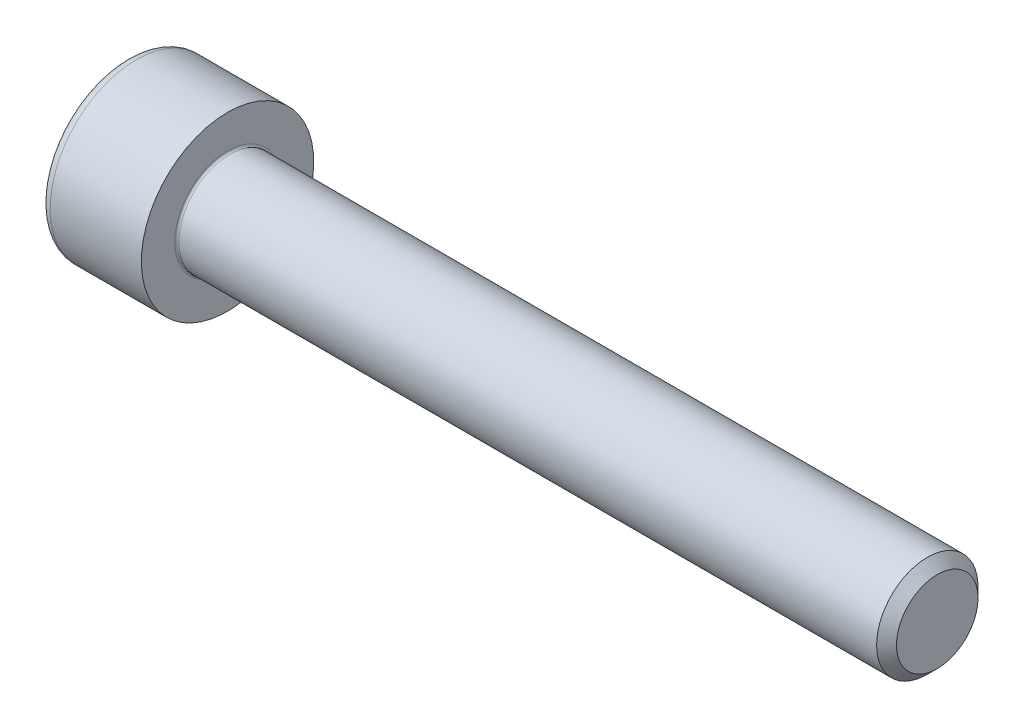
ISO-10303-21;
HEADER;
FILE_DESCRIPTION(('STEP AP214'),'2;1');
FILE_NAME('part.step','',(''),(''),'','','');
FILE_SCHEMA(('AUTOMOTIVE_DESIGN { 1 0 10303 214 1 1 1 1 }'));
ENDSEC;
DATA;
#1=APPLICATION_CONTEXT('core data for automotive mechanical design processes');
#2=APPLICATION_PROTOCOL_DEFINITION('international standard','automotive_design',2000,#1);
#3=PRODUCT_CONTEXT('',#1,'mechanical');
#4=PRODUCT('Part','Part','',(#3));
#5=PRODUCT_RELATED_PRODUCT_CATEGORY('part','',(#4));
#6=PRODUCT_DEFINITION_FORMATION('','',#4);
#7=PRODUCT_DEFINITION_CONTEXT('part definition',#1,'design');
#8=PRODUCT_DEFINITION('design','',#6,#7);
#9=PRODUCT_DEFINITION_SHAPE('','',#8);
#10=(LENGTH_UNIT() NAMED_UNIT(*) SI_UNIT(.MILLI.,.METRE.));
#11=(NAMED_UNIT(*) PLANE_ANGLE_UNIT() SI_UNIT($,.RADIAN.));
#12=(NAMED_UNIT(*) SI_UNIT($,.STERADIAN.) SOLID_ANGLE_UNIT());
#13=UNCERTAINTY_MEASURE_WITH_UNIT(LENGTH_MEASURE(1.E-05),#10,'distance_accuracy_value','');
#14=(GEOMETRIC_REPRESENTATION_CONTEXT(3) GLOBAL_UNCERTAINTY_ASSIGNED_CONTEXT((#13)) GLOBAL_UNIT_ASSIGNED_CONTEXT((#10,
#11,#12)) REPRESENTATION_CONTEXT('',''));
#15=CARTESIAN_POINT('',(0.,0.,0.));
#16=DIRECTION('',(0.,0.,1.));
#17=DIRECTION('',(1.,0.,0.));
#18=AXIS2_PLACEMENT_3D('',#15,#16,#17);
#19=CARTESIAN_POINT('',(-2.50800000128493,0.,0.));
#20=DIRECTION('',(-1.,0.,0.));
#21=DIRECTION('',(0.,0.,1.));
#22=AXIS2_PLACEMENT_3D('',#19,#20,#21);
#23=CONICAL_SURFACE('',#22,2.32325748231688,1.04719754991398);
#24=CARTESIAN_POINT('',(-1.16666666468745,-1.70530256582424E-10,0.));
#25=VERTEX_POINT('',#24);
#26=VERTEX_LOOP('',#25);
#27=FACE_BOUND('',#26,.T.);
#28=CARTESIAN_POINT('',(-2.50000000144598,2.00000000032935,1.15470053796183));
#29=CARTESIAN_POINT('',(-2.47069554662332,2.00000000011829,1.05321634684252));
#30=CARTESIAN_POINT('',(-2.44404467857914,2.00000000003171,0.950856145644057));
#31=CARTESIAN_POINT('',(-2.39752638879754,1.99999999996822,0.74436344483934));
#32=CARTESIAN_POINT('',(-2.37767542167161,1.99999999999159,0.640227277451711));
#33=CARTESIAN_POINT('',(-2.34677596020227,2.00000000000821,0.433245449996193));
#34=CARTESIAN_POINT('',(-2.33552178883748,2.00000000000219,0.330431627814834));
#35=CARTESIAN_POINT('',(-2.32208916936555,1.99999999999782,0.124320462843912));
#36=CARTESIAN_POINT('',(-2.31989959521926,1.99999999999945,0.0210238686983639));
#37=CARTESIAN_POINT('',(-2.32446629144478,2.00000000000048,-0.17197473597635));
#38=CARTESIAN_POINT('',(-2.33010128653034,2.00000000000013,-0.261705707519009));
#39=CARTESIAN_POINT('',(-2.34795730208613,1.99999999999987,-0.440583082591421));
#40=CARTESIAN_POINT('',(-2.36018441616651,1.99999999999996,-0.52972886789387));
#41=CARTESIAN_POINT('',(-2.39074983480228,2.00000000000004,-0.708974747227483));
#42=CARTESIAN_POINT('',(-2.40921764371906,2.00000000000002,-0.799052166717739));
#43=CARTESIAN_POINT('',(-2.45113176241741,1.99999999999998,-0.977863889553509));
#44=CARTESIAN_POINT('',(-2.47456823037067,1.99999999999996,-1.06660048191678));
#45=CARTESIAN_POINT('',(-2.50000000166014,2.,-1.15470053795676));
#46=B_SPLINE_CURVE_WITH_KNOTS('',3,(#28,#29,#30,#31,#32,#33,#34,#35,#36,#37,#38,#39,#40,#41,#42,
#43,#44,#45),.UNSPECIFIED.,.F.,.F.,(4,2,2,2,2,2,2,2,4),(0.,0.317016011622895,0.6347938171706,
0.944707606337703,1.25424088911858,1.52370778260774,1.79342419352783,2.06912162199575,
2.3442779727913),.UNSPECIFIED.);
#47=CARTESIAN_POINT('',(-2.50000000164502,1.99999999979437,1.15470053826053));
#48=VERTEX_POINT('',#47);
#49=CARTESIAN_POINT('',(-2.50000000171356,2.,-1.15470053814181));
#50=VERTEX_POINT('',#49);
#51=EDGE_CURVE('E21',#48,#50,#46,.T.);
#52=ORIENTED_EDGE('',*,*,#51,.T.);
#53=CARTESIAN_POINT('',(-2.50000000144598,1.99999999980318,-1.15470053887319));
#54=CARTESIAN_POINT('',(-2.47069554662332,1.91211211210581,-1.20544263425006));
#55=CARTESIAN_POINT('',(-2.44404467857914,1.82346557748816,-1.2566227347743));
#56=CARTESIAN_POINT('',(-2.39752638879754,1.64463765286348,-1.35986908512169));
#57=CARTESIAN_POINT('',(-2.37767542167161,1.55445308646473,-1.41193716883574));
#58=CARTESIAN_POINT('',(-2.34677596020227,1.37520156577483,-1.51542808257789));
#59=CARTESIAN_POINT('',(-2.33552178883748,1.28616218390259,-1.56683499366335));
#60=CARTESIAN_POINT('',(-2.32208916936555,1.10766467903198,-1.66989057614503));
#61=CARTESIAN_POINT('',(-2.31989959521926,1.01820720437834,-1.72153887321922));
#62=CARTESIAN_POINT('',(-2.32446629144478,0.851065509835601,-1.81803817555747));
#63=CARTESIAN_POINT('',(-2.33010128653034,0.773356208973225,-1.86290366132849));
#64=CARTESIAN_POINT('',(-2.34795730208613,0.61844385799811,-1.95234234886448));
#65=CARTESIAN_POINT('',(-2.36018441616651,0.541241343285922,-1.99691524151578));
#66=CARTESIAN_POINT('',(-2.39074983480228,0.38600985825937,-2.08653818118265));
#67=CARTESIAN_POINT('',(-2.40921764371906,0.30800052467345,-2.13157689092776));
#68=CARTESIAN_POINT('',(-2.45113176241741,0.153145030203193,-2.22098275234562));
#69=CARTESIAN_POINT('',(-2.47456823037067,0.0762968869713288,-2.26535104852723));
#70=CARTESIAN_POINT('',(-2.50000000166014,3.65892201025004E-10,-2.30940107654726));
#71=B_SPLINE_CURVE_WITH_KNOTS('',3,(#53,#54,#55,#56,#57,#58,#59,#60,#61,#62,#63,#64,#65,#66,#67,
#68,#69,#70),.UNSPECIFIED.,.F.,.F.,(4,2,2,2,2,2,2,2,4),(0.,0.317016011622895,0.634793817170599,
0.944707606337703,1.25424088911857,1.52370778260774,1.79342419352783,2.06912162199575,
2.3442779727913),.UNSPECIFIED.);
#72=CARTESIAN_POINT('',(-2.50000000164502,0.,-2.30940107652106));
#73=VERTEX_POINT('',#72);
#74=EDGE_CURVE('E81',#50,#73,#71,.T.);
#75=ORIENTED_EDGE('',*,*,#74,.T.);
#76=CARTESIAN_POINT('',(-2.50000000144598,-5.26170709146343E-10,-2.30940107683502));
#77=CARTESIAN_POINT('',(-2.47069554662332,-0.0878878880124767,-2.25865898109258));
#78=CARTESIAN_POINT('',(-2.44404467857914,-0.17653442254354,-2.20747888041836));
#79=CARTESIAN_POINT('',(-2.39752638879754,-0.355362347104743,-2.10423252996103));
#80=CARTESIAN_POINT('',(-2.37767542167161,-0.445546913526861,-2.05216444628745));
#81=CARTESIAN_POINT('',(-2.34677596020227,-0.624798434233376,-1.94867353257408));
#82=CARTESIAN_POINT('',(-2.33552178883748,-0.7138378160996,-1.89726662147819));
#83=CARTESIAN_POINT('',(-2.32208916936555,-0.892335320965837,-1.79421103898894));
#84=CARTESIAN_POINT('',(-2.31989959521926,-0.981792795621112,-1.74256274191759));
#85=CARTESIAN_POINT('',(-2.32446629144478,-1.14893449016488,-1.64606343958112));
#86=CARTESIAN_POINT('',(-2.33010128653034,-1.2266437910269,-1.60119795380949));
#87=CARTESIAN_POINT('',(-2.34795730208613,-1.38155614200176,-1.51175926627306));
#88=CARTESIAN_POINT('',(-2.36018441616651,-1.45875865671404,-1.46718637362191));
#89=CARTESIAN_POINT('',(-2.39074983480228,-1.61399014174067,-1.37756343395517));
#90=CARTESIAN_POINT('',(-2.40921764371906,-1.69199947532657,-1.33252472421003));
#91=CARTESIAN_POINT('',(-2.45113176241741,-1.84685496979679,-1.24311886279211));
#92=CARTESIAN_POINT('',(-2.47456823037067,-1.92370311302863,-1.19875056661046));
#93=CARTESIAN_POINT('',(-2.50000000166014,-1.99999999963411,-1.1547005385905));
#94=B_SPLINE_CURVE_WITH_KNOTS('',3,(#76,#77,#78,#79,#80,#81,#82,#83,#84,#85,#86,#87,#88,#89,#90,
#91,#92,#93),.UNSPECIFIED.,.F.,.F.,(4,2,2,2,2,2,2,2,4),(0.,0.317016011622895,0.634793817170599,
0.944707606337702,1.25424088911857,1.52370778260774,1.79342419352783,2.06912162199575,
2.3442779727913),.UNSPECIFIED.);
#95=CARTESIAN_POINT('',(-2.50000000164502,-1.99999999979437,-1.15470053826053));
#96=VERTEX_POINT('',#95);
#97=EDGE_CURVE('E106',#73,#96,#94,.T.);
#98=ORIENTED_EDGE('',*,*,#97,.T.);
#99=CARTESIAN_POINT('',(-2.50000000144598,-2.00000000032935,-1.15470053796183));
#100=CARTESIAN_POINT('',(-2.47069554662332,-2.00000000011829,-1.05321634684252));
#101=CARTESIAN_POINT('',(-2.44404467857914,-2.0000000000317,-0.95085614564406));
#102=CARTESIAN_POINT('',(-2.39752638879754,-1.99999999996822,-0.744363444839343));
#103=CARTESIAN_POINT('',(-2.37767542167161,-1.99999999999159,-0.640227277451715));
#104=CARTESIAN_POINT('',(-2.34677596020227,-2.00000000000821,-0.433245449996196));
#105=CARTESIAN_POINT('',(-2.33552178883748,-2.00000000000219,-0.330431627814838));
#106=CARTESIAN_POINT('',(-2.32208916936555,-1.99999999999782,-0.124320462843916));
#107=CARTESIAN_POINT('',(-2.31989959521926,-1.99999999999945,-0.0210238686983675));
#108=CARTESIAN_POINT('',(-2.32446629144478,-2.00000000000048,0.171974735976346));
#109=CARTESIAN_POINT('',(-2.33010128653034,-2.00000000000013,0.261705707519006));
#110=CARTESIAN_POINT('',(-2.34795730208613,-1.99999999999987,0.440583082591418));
#111=CARTESIAN_POINT('',(-2.36018441616651,-1.99999999999996,0.529728867893867));
#112=CARTESIAN_POINT('',(-2.39074983480228,-2.00000000000004,0.70897474722748));
#113=CARTESIAN_POINT('',(-2.40921764371906,-2.00000000000002,0.799052166717737));
#114=CARTESIAN_POINT('',(-2.45113176241741,-1.99999999999998,0.977863889553506));
#115=CARTESIAN_POINT('',(-2.47456823037067,-1.99999999999996,1.06660048191678));
#116=CARTESIAN_POINT('',(-2.50000000166014,-2.,1.15470053795676));
#117=B_SPLINE_CURVE_WITH_KNOTS('',3,(#99,#100,#101,#102,#103,#104,#105,#106,#107,#108,#109,#110,
#111,#112,#113,#114,#115,#116),.UNSPECIFIED.,.F.,.F.,(4,2,2,2,2,2,2,2,4),(0.,0.317016011622895,
0.634793817170599,0.944707606337703,1.25424088911857,1.52370778260774,1.79342419352783,
2.06912162199575,2.3442779727913),.UNSPECIFIED.);
#118=CARTESIAN_POINT('',(-2.50000000164502,-1.99999999979437,1.15470053826053));
#119=VERTEX_POINT('',#118);
#120=EDGE_CURVE('E130',#96,#119,#117,.T.);
#121=ORIENTED_EDGE('',*,*,#120,.T.);
#122=CARTESIAN_POINT('',(-2.50000000144598,-1.99999999980318,1.15470053887318));
#123=CARTESIAN_POINT('',(-2.47069554662332,-1.91211211210581,1.20544263425006));
#124=CARTESIAN_POINT('',(-2.44404467857914,-1.82346557748816,1.2566227347743));
#125=CARTESIAN_POINT('',(-2.39752638879754,-1.64463765286348,1.35986908512168));
#126=CARTESIAN_POINT('',(-2.37767542167161,-1.55445308646473,1.41193716883573));
#127=CARTESIAN_POINT('',(-2.34677596020227,-1.37520156577483,1.51542808257788));
#128=CARTESIAN_POINT('',(-2.33552178883748,-1.28616218390259,1.56683499366335));
#129=CARTESIAN_POINT('',(-2.32208916936555,-1.10766467903198,1.66989057614503));
#130=CARTESIAN_POINT('',(-2.31989959521926,-1.01820720437834,1.72153887321922));
#131=CARTESIAN_POINT('',(-2.32446629144478,-0.851065509835602,1.81803817555746));
#132=CARTESIAN_POINT('',(-2.33010128653034,-0.773356208973226,1.86290366132849));
#133=CARTESIAN_POINT('',(-2.34795730208613,-0.61844385799811,1.95234234886448));
#134=CARTESIAN_POINT('',(-2.36018441616651,-0.541241343285922,1.99691524151578));
#135=CARTESIAN_POINT('',(-2.39074983480228,-0.38600985825937,2.08653818118265));
#136=CARTESIAN_POINT('',(-2.40921764371906,-0.30800052467345,2.13157689092776));
#137=CARTESIAN_POINT('',(-2.45113176241741,-0.153145030203193,2.22098275234561));
#138=CARTESIAN_POINT('',(-2.47456823037067,-0.076296886971328,2.26535104852723));
#139=CARTESIAN_POINT('',(-2.50000000166014,-3.65891067023528E-10,2.30940107654726));
#140=B_SPLINE_CURVE_WITH_KNOTS('',3,(#122,#123,#124,#125,#126,#127,#128,#129,#130,#131,#132,
#133,#134,#135,#136,#137,#138,#139),.UNSPECIFIED.,.F.,.F.,(4,2,2,2,2,2,2,2,4),(0.,
0.317016011622895,0.634793817170599,0.944707606337703,1.25424088911857,1.52370778260774,
1.79342419352784,2.06912162199575,2.3442779727913),.UNSPECIFIED.);
#141=CARTESIAN_POINT('',(-2.50000000164502,0.,2.30940107652106));
#142=VERTEX_POINT('',#141);
#143=EDGE_CURVE('E138',#119,#142,#140,.T.);
#144=ORIENTED_EDGE('',*,*,#143,.T.);
#145=CARTESIAN_POINT('',(-2.50000000144598,5.26171169499549E-10,2.30940107683502));
#146=CARTESIAN_POINT('',(-2.47069554662332,0.087887888012477,2.25865898109258));
#147=CARTESIAN_POINT('',(-2.44404467857914,0.17653442254354,2.20747888041836));
#148=CARTESIAN_POINT('',(-2.39752638879754,0.355362347104743,2.10423252996103));
#149=CARTESIAN_POINT('',(-2.37767542167161,0.445546913526861,2.05216444628745));
#150=CARTESIAN_POINT('',(-2.34677596020227,0.624798434233376,1.94867353257408));
#151=CARTESIAN_POINT('',(-2.33552178883748,0.713837816099599,1.89726662147819));
#152=CARTESIAN_POINT('',(-2.32208916936555,0.892335320965837,1.79421103898894));
#153=CARTESIAN_POINT('',(-2.31989959521926,0.981792795621111,1.74256274191759));
#154=CARTESIAN_POINT('',(-2.32446629144478,1.14893449016488,1.64606343958112));
#155=CARTESIAN_POINT('',(-2.33010128653034,1.2266437910269,1.60119795380948));
#156=CARTESIAN_POINT('',(-2.34795730208613,1.38155614200176,1.51175926627305));
#157=CARTESIAN_POINT('',(-2.3601844161665,1.45875865671404,1.46718637362191));
#158=CARTESIAN_POINT('',(-2.39074983480228,1.61399014174067,1.37756343395517));
#159=CARTESIAN_POINT('',(-2.40921764371906,1.69199947532657,1.33252472421002));
#160=CARTESIAN_POINT('',(-2.45113176241741,1.84685496979679,1.2431188627921));
#161=CARTESIAN_POINT('',(-2.47456823037067,1.92370311302863,1.19875056661045));
#162=CARTESIAN_POINT('',(-2.50000000166014,1.99999999963411,1.1547005385905));
#163=B_SPLINE_CURVE_WITH_KNOTS('',3,(#145,#146,#147,#148,#149,#150,#151,#152,#153,#154,#155,
#156,#157,#158,#159,#160,#161,#162),.UNSPECIFIED.,.F.,.F.,(4,2,2,2,2,2,2,2,4),(0.,
0.317016011622895,0.634793817170599,0.944707606337702,1.25424088911857,1.52370778260774,
1.79342419352783,2.06912162199575,2.3442779727913),.UNSPECIFIED.);
#164=EDGE_CURVE('E83',#142,#48,#163,.T.);
#165=ORIENTED_EDGE('',*,*,#164,.T.);
#166=EDGE_LOOP('',(#52,#75,#98,#121,#144,#165));
#167=FACE_BOUND('',#166,.T.);
#168=ADVANCED_FACE('F17',(#27,#167),#23,.F.);
#169=CARTESIAN_POINT('',(-5.,2.,1.15470053837925));
#170=DIRECTION('',(0.,1.,0.));
#171=DIRECTION('',(0.,0.,1.));
#172=AXIS2_PLACEMENT_3D('',#169,#170,#171);
#173=PLANE('',#172);
#174=DIRECTION('',(1.,0.,0.));
#175=VECTOR('',#174,1.);
#176=CARTESIAN_POINT('',(-5.,2.,1.15470053837925));
#177=LINE('',#176,#175);
#178=CARTESIAN_POINT('',(-5.,2.,1.15470053837925));
#179=VERTEX_POINT('',#178);
#180=EDGE_CURVE('E85',#48,#179,#177,.F.);
#181=ORIENTED_EDGE('',*,*,#180,.T.);
#182=DIRECTION('',(0.,0.,1.));
#183=VECTOR('',#182,1.);
#184=CARTESIAN_POINT('',(-5.,2.,0.));
#185=LINE('',#184,#183);
#186=CARTESIAN_POINT('',(-5.,2.,-1.15470053837925));
#187=VERTEX_POINT('',#186);
#188=EDGE_CURVE('E90',#187,#179,#185,.T.);
#189=ORIENTED_EDGE('',*,*,#188,.F.);
#190=DIRECTION('',(1.,0.,0.));
#191=VECTOR('',#190,1.);
#192=CARTESIAN_POINT('',(-5.,2.,-1.15470053837925));
#193=LINE('',#192,#191);
#194=EDGE_CURVE('E88',#187,#50,#193,.T.);
#195=ORIENTED_EDGE('',*,*,#194,.T.);
#196=ORIENTED_EDGE('',*,*,#51,.F.);
#197=EDGE_LOOP('',(#181,#189,#195,#196));
#198=FACE_BOUND('',#197,.T.);
#199=ADVANCED_FACE('F77',(#198),#173,.F.);
#200=CARTESIAN_POINT('',(-5.,0.,2.3094010767585));
#201=DIRECTION('',(0.,0.500000000000001,0.866025403784438));
#202=DIRECTION('',(0.,-0.866025403784438,0.500000000000001));
#203=AXIS2_PLACEMENT_3D('',#200,#201,#202);
#204=PLANE('',#203);
#205=DIRECTION('',(1.,0.,0.));
#206=VECTOR('',#205,1.);
#207=CARTESIAN_POINT('',(-5.,0.,2.3094010767585));
#208=LINE('',#207,#206);
#209=CARTESIAN_POINT('',(-5.,0.,2.3094010767585));
#210=VERTEX_POINT('',#209);
#211=EDGE_CURVE('E142',#142,#210,#208,.F.);
#212=ORIENTED_EDGE('',*,*,#211,.T.);
#213=DIRECTION('',(0.,-0.866025403784438,0.5));
#214=VECTOR('',#213,1.);
#215=CARTESIAN_POINT('',(-5.,2.,1.15470053837925));
#216=LINE('',#215,#214);
#217=EDGE_CURVE('E96',#179,#210,#216,.T.);
#218=ORIENTED_EDGE('',*,*,#217,.F.);
#219=ORIENTED_EDGE('',*,*,#180,.F.);
#220=ORIENTED_EDGE('',*,*,#164,.F.);
#221=EDGE_LOOP('',(#212,#218,#219,#220));
#222=FACE_BOUND('',#221,.T.);
#223=ADVANCED_FACE('F146',(#222),#204,.F.);
#224=CARTESIAN_POINT('',(-5.,-2.,1.15470053837925));
#225=DIRECTION('',(0.,-0.5,0.866025403784439));
#226=DIRECTION('',(0.,-0.866025403784439,-0.5));
#227=AXIS2_PLACEMENT_3D('',#224,#225,#226);
#228=PLANE('',#227);
#229=DIRECTION('',(1.,0.,0.));
#230=VECTOR('',#229,1.);
#231=CARTESIAN_POINT('',(-5.,-2.,1.15470053837925));
#232=LINE('',#231,#230);
#233=CARTESIAN_POINT('',(-5.,-2.,1.15470053837925));
#234=VERTEX_POINT('',#233);
#235=EDGE_CURVE('E137',#119,#234,#232,.F.);
#236=ORIENTED_EDGE('',*,*,#235,.T.);
#237=DIRECTION('',(0.,-0.866025403784439,-0.5));
#238=VECTOR('',#237,1.);
#239=CARTESIAN_POINT('',(-5.,0.,2.3094010767585));
#240=LINE('',#239,#238);
#241=EDGE_CURVE('E265',#210,#234,#240,.T.);
#242=ORIENTED_EDGE('',*,*,#241,.F.);
#243=ORIENTED_EDGE('',*,*,#211,.F.);
#244=ORIENTED_EDGE('',*,*,#143,.F.);
#245=EDGE_LOOP('',(#236,#242,#243,#244));
#246=FACE_BOUND('',#245,.T.);
#247=ADVANCED_FACE('F126',(#246),#228,.F.);
#248=CARTESIAN_POINT('',(-5.,-2.,-1.15470053837925));
#249=DIRECTION('',(0.,-1.,0.));
#250=DIRECTION('',(0.,0.,-1.));
#251=AXIS2_PLACEMENT_3D('',#248,#249,#250);
#252=PLANE('',#251);
#253=DIRECTION('',(1.,0.,0.));
#254=VECTOR('',#253,1.);
#255=CARTESIAN_POINT('',(-5.,-2.,-1.15470053837925));
#256=LINE('',#255,#254);
#257=CARTESIAN_POINT('',(-5.,-2.,-1.15470053837925));
#258=VERTEX_POINT('',#257);
#259=EDGE_CURVE('E136',#96,#258,#256,.F.);
#260=ORIENTED_EDGE('',*,*,#259,.T.);
#261=DIRECTION('',(0.,0.,1.));
#262=VECTOR('',#261,1.);
#263=CARTESIAN_POINT('',(-5.,-2.,0.));
#264=LINE('',#263,#262);
#265=EDGE_CURVE('E260',#234,#258,#264,.F.);
#266=ORIENTED_EDGE('',*,*,#265,.F.);
#267=ORIENTED_EDGE('',*,*,#235,.F.);
#268=ORIENTED_EDGE('',*,*,#120,.F.);
#269=EDGE_LOOP('',(#260,#266,#267,#268));
#270=FACE_BOUND('',#269,.T.);
#271=ADVANCED_FACE('F122',(#270),#252,.F.);
#272=CARTESIAN_POINT('',(-5.,0.,-2.3094010767585));
#273=DIRECTION('',(0.,-0.5,-0.866025403784439));
#274=DIRECTION('',(0.,0.866025403784439,-0.5));
#275=AXIS2_PLACEMENT_3D('',#272,#273,#274);
#276=PLANE('',#275);
#277=DIRECTION('',(1.,0.,0.));
#278=VECTOR('',#277,1.);
#279=CARTESIAN_POINT('',(-5.,0.,-2.3094010767585));
#280=LINE('',#279,#278);
#281=CARTESIAN_POINT('',(-5.,0.,-2.3094010767585));
#282=VERTEX_POINT('',#281);
#283=EDGE_CURVE('E39',#73,#282,#280,.F.);
#284=ORIENTED_EDGE('',*,*,#283,.T.);
#285=DIRECTION('',(0.,0.866025403784439,-0.5));
#286=VECTOR('',#285,1.);
#287=CARTESIAN_POINT('',(-5.,-2.,-1.15470053837925));
#288=LINE('',#287,#286);
#289=EDGE_CURVE('E255',#258,#282,#288,.T.);
#290=ORIENTED_EDGE('',*,*,#289,.F.);
#291=ORIENTED_EDGE('',*,*,#259,.F.);
#292=ORIENTED_EDGE('',*,*,#97,.F.);
#293=EDGE_LOOP('',(#284,#290,#291,#292));
#294=FACE_BOUND('',#293,.T.);
#295=ADVANCED_FACE('F116',(#294),#276,.F.);
#296=CARTESIAN_POINT('',(-5.,2.,-1.15470053837925));
#297=DIRECTION('',(0.,0.5,-0.866025403784439));
#298=DIRECTION('',(0.,0.866025403784439,0.5));
#299=AXIS2_PLACEMENT_3D('',#296,#297,#298);
#300=PLANE('',#299);
#301=ORIENTED_EDGE('',*,*,#194,.F.);
#302=DIRECTION('',(0.,0.866025403784439,0.499999999999999));
#303=VECTOR('',#302,1.);
#304=CARTESIAN_POINT('',(-5.,0.,-2.3094010767585));
#305=LINE('',#304,#303);
#306=EDGE_CURVE('E253',#282,#187,#305,.T.);
#307=ORIENTED_EDGE('',*,*,#306,.F.);
#308=ORIENTED_EDGE('',*,*,#283,.F.);
#309=ORIENTED_EDGE('',*,*,#74,.F.);
#310=EDGE_LOOP('',(#301,#307,#308,#309));
#311=FACE_BOUND('',#310,.T.);
#312=ADVANCED_FACE('F94',(#311),#300,.F.);
#313=CARTESIAN_POINT('',(-5.,3.27970053837925,0.));
#314=DIRECTION('',(-1.,0.,0.));
#315=DIRECTION('',(0.,0.,1.));
#316=AXIS2_PLACEMENT_3D('',#313,#314,#315);
#317=PLANE('',#316);
#318=ORIENTED_EDGE('',*,*,#289,.T.);
#319=ORIENTED_EDGE('',*,*,#306,.T.);
#320=ORIENTED_EDGE('',*,*,#188,.T.);
#321=ORIENTED_EDGE('',*,*,#217,.T.);
#322=ORIENTED_EDGE('',*,*,#241,.T.);
#323=ORIENTED_EDGE('',*,*,#265,.T.);
#324=EDGE_LOOP('',(#318,#319,#320,#321,#322,#323));
#325=FACE_BOUND('',#324,.T.);
#326=CARTESIAN_POINT('',(-5.,0.,0.));
#327=DIRECTION('',(1.,0.,0.));
#328=DIRECTION('',(0.,1.,0.));
#329=AXIS2_PLACEMENT_3D('',#326,#327,#328);
#330=CIRCLE('',#329,3.75);
#331=CARTESIAN_POINT('',(-5.,3.75,0.));
#332=VERTEX_POINT('',#331);
#333=EDGE_CURVE('E216',#332,#332,#330,.T.);
#334=ORIENTED_EDGE('',*,*,#333,.F.);
#335=EDGE_LOOP('',(#334));
#336=FACE_BOUND('',#335,.T.);
#337=ADVANCED_FACE('F115',(#325,#336),#317,.T.);
#338=CARTESIAN_POINT('',(-4.5,0.,0.));
#339=DIRECTION('',(1.,0.,0.));
#340=DIRECTION('',(0.,0.,-1.));
#341=AXIS2_PLACEMENT_3D('',#338,#339,#340);
#342=TOROIDAL_SURFACE('',#341,3.75,0.5);
#343=CARTESIAN_POINT('',(-4.5,0.,0.));
#344=DIRECTION('',(1.,0.,0.));
#345=DIRECTION('',(0.,1.,0.));
#346=AXIS2_PLACEMENT_3D('',#343,#344,#345);
#347=CIRCLE('',#346,4.25);
#348=CARTESIAN_POINT('',(-4.5,4.25,0.));
#349=VERTEX_POINT('',#348);
#350=EDGE_CURVE('E280',#349,#349,#347,.T.);
#351=ORIENTED_EDGE('',*,*,#350,.F.);
#352=EDGE_LOOP('',(#351));
#353=FACE_BOUND('',#352,.T.);
#354=ORIENTED_EDGE('',*,*,#333,.T.);
#355=EDGE_LOOP('',(#354));
#356=FACE_BOUND('',#355,.T.);
#357=ADVANCED_FACE('F200',(#353,#356),#342,.T.);
#358=CARTESIAN_POINT('',(-2.5,0.,0.));
#359=DIRECTION('',(1.,0.,0.));
#360=DIRECTION('',(0.,1.,0.));
#361=AXIS2_PLACEMENT_3D('',#358,#359,#360);
#362=CYLINDRICAL_SURFACE('',#361,4.25);
#363=ORIENTED_EDGE('',*,*,#350,.T.);
#364=EDGE_LOOP('',(#363));
#365=FACE_BOUND('',#364,.T.);
#366=CARTESIAN_POINT('',(0.,0.,0.));
#367=DIRECTION('',(1.,0.,0.));
#368=DIRECTION('',(0.,1.,0.));
#369=AXIS2_PLACEMENT_3D('',#366,#367,#368);
#370=CIRCLE('',#369,4.25);
#371=CARTESIAN_POINT('',(0.,4.25,0.));
#372=VERTEX_POINT('',#371);
#373=EDGE_CURVE('E104',#372,#372,#370,.T.);
#374=ORIENTED_EDGE('',*,*,#373,.F.);
#375=EDGE_LOOP('',(#374));
#376=FACE_BOUND('',#375,.T.);
#377=ADVANCED_FACE('F197',(#365,#376),#362,.T.);
#378=CARTESIAN_POINT('',(35.,1.25,0.));
#379=DIRECTION('',(1.,0.,0.));
#380=DIRECTION('',(0.,0.,-1.));
#381=AXIS2_PLACEMENT_3D('',#378,#379,#380);
#382=PLANE('',#381);
#383=CARTESIAN_POINT('',(35.0000000001955,0.,0.));
#384=DIRECTION('',(-1.,0.,0.));
#385=DIRECTION('',(0.,0.,1.));
#386=AXIS2_PLACEMENT_3D('',#383,#384,#385);
#387=CIRCLE('',#386,2.0092400002909);
#388=CARTESIAN_POINT('',(35.0000000001955,0.,2.0092400002909));
#389=VERTEX_POINT('',#388);
#390=EDGE_CURVE('E275',#389,#389,#387,.T.);
#391=ORIENTED_EDGE('',*,*,#390,.F.);
#392=EDGE_LOOP('',(#391));
#393=FACE_BOUND('',#392,.T.);
#394=ADVANCED_FACE('F194',(#393),#382,.T.);
#395=CARTESIAN_POINT('',(0.,3.375,0.));
#396=DIRECTION('',(1.,0.,0.));
#397=DIRECTION('',(0.,0.,-1.));
#398=AXIS2_PLACEMENT_3D('',#395,#396,#397);
#399=PLANE('',#398);
#400=CARTESIAN_POINT('',(0.,0.,0.));
#401=DIRECTION('',(1.,0.,0.));
#402=DIRECTION('',(0.,1.,0.));
#403=AXIS2_PLACEMENT_3D('',#400,#401,#402);
#404=CIRCLE('',#403,2.6);
#405=CARTESIAN_POINT('',(0.,2.6,0.));
#406=VERTEX_POINT('',#405);
#407=EDGE_CURVE('E181',#406,#406,#404,.F.);
#408=ORIENTED_EDGE('',*,*,#407,.T.);
#409=EDGE_LOOP('',(#408));
#410=FACE_BOUND('',#409,.T.);
#411=ORIENTED_EDGE('',*,*,#373,.T.);
#412=EDGE_LOOP('',(#411));
#413=FACE_BOUND('',#412,.T.);
#414=ADVANCED_FACE('F185',(#410,#413),#399,.T.);
#415=CARTESIAN_POINT('',(34.5092399998634,0.,0.));
#416=DIRECTION('',(-1.,0.,0.));
#417=DIRECTION('',(0.,0.,1.));
#418=AXIS2_PLACEMENT_3D('',#415,#416,#417);
#419=CONICAL_SURFACE('',#418,2.49999999971351,0.78539816247083);
#420=ORIENTED_EDGE('',*,*,#390,.T.);
#421=EDGE_LOOP('',(#420));
#422=FACE_BOUND('',#421,.T.);
#423=CARTESIAN_POINT('',(34.50924,0.,0.));
#424=DIRECTION('',(1.,0.,0.));
#425=DIRECTION('',(0.,1.,0.));
#426=AXIS2_PLACEMENT_3D('',#423,#424,#425);
#427=CIRCLE('',#426,2.5);
#428=CARTESIAN_POINT('',(34.50924,2.5,0.));
#429=VERTEX_POINT('',#428);
#430=EDGE_CURVE('E30',#429,#429,#427,.F.);
#431=ORIENTED_EDGE('',*,*,#430,.F.);
#432=EDGE_LOOP('',(#431));
#433=FACE_BOUND('',#432,.T.);
#434=ADVANCED_FACE('F163',(#422,#433),#419,.T.);
#435=CARTESIAN_POINT('',(0.100000000000002,0.,0.));
#436=DIRECTION('',(1.,0.,0.));
#437=DIRECTION('',(0.,0.,-1.));
#438=AXIS2_PLACEMENT_3D('',#435,#436,#437);
#439=TOROIDAL_SURFACE('',#438,2.6,0.1);
#440=CARTESIAN_POINT('',(0.100000000000003,0.,0.));
#441=DIRECTION('',(1.,0.,0.));
#442=DIRECTION('',(0.,1.,0.));
#443=AXIS2_PLACEMENT_3D('',#440,#441,#442);
#444=CIRCLE('',#443,2.5);
#445=CARTESIAN_POINT('',(0.100000000000003,2.5,0.));
#446=VERTEX_POINT('',#445);
#447=EDGE_CURVE('E11',#446,#446,#444,.T.);
#448=ORIENTED_EDGE('',*,*,#447,.F.);
#449=EDGE_LOOP('',(#448));
#450=FACE_BOUND('',#449,.T.);
#451=ORIENTED_EDGE('',*,*,#407,.F.);
#452=EDGE_LOOP('',(#451));
#453=FACE_BOUND('',#452,.T.);
#454=ADVANCED_FACE('F157',(#450,#453),#439,.F.);
#455=CARTESIAN_POINT('',(24.,0.,0.));
#456=DIRECTION('',(1.,0.,0.));
#457=DIRECTION('',(0.,1.,0.));
#458=AXIS2_PLACEMENT_3D('',#455,#456,#457);
#459=CYLINDRICAL_SURFACE('',#458,2.5);
#460=ORIENTED_EDGE('',*,*,#447,.T.);
#461=EDGE_LOOP('',(#460));
#462=FACE_BOUND('',#461,.T.);
#463=ORIENTED_EDGE('',*,*,#430,.T.);
#464=EDGE_LOOP('',(#463));
#465=FACE_BOUND('',#464,.T.);
#466=ADVANCED_FACE('F155',(#462,#465),#459,.T.);
#467=CLOSED_SHELL('',(#168,#199,#223,#247,#271,#295,#312,#337,#357,#377,#394,#414,#434,#454,#466));
#468=MANIFOLD_SOLID_BREP('B1',#467);
#469=ADVANCED_BREP_SHAPE_REPRESENTATION('',(#18,#468),#14);
#470=SHAPE_DEFINITION_REPRESENTATION(#9,#469);
ENDSEC;
END-ISO-10303-21;
